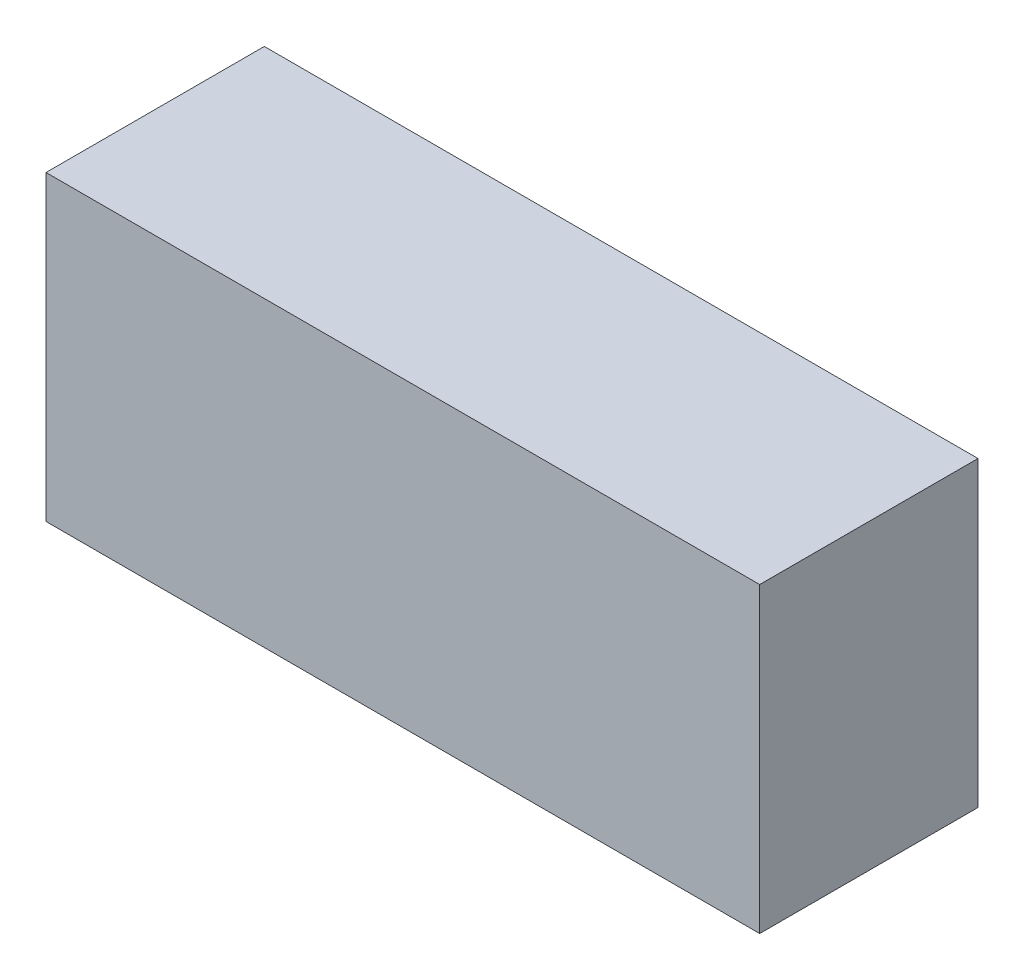
ISO-10303-21;
HEADER;
FILE_DESCRIPTION(('STEP AP214'),'2;1');
FILE_NAME('part.step','',(''),(''),'','','');
FILE_SCHEMA(('AUTOMOTIVE_DESIGN { 1 0 10303 214 1 1 1 1 }'));
ENDSEC;
DATA;
#1=APPLICATION_CONTEXT('core data for automotive mechanical design processes');
#2=APPLICATION_PROTOCOL_DEFINITION('international standard','automotive_design',2000,#1);
#3=PRODUCT_CONTEXT('',#1,'mechanical');
#4=PRODUCT('Part','Part','',(#3));
#5=PRODUCT_RELATED_PRODUCT_CATEGORY('part','',(#4));
#6=PRODUCT_DEFINITION_FORMATION('','',#4);
#7=PRODUCT_DEFINITION_CONTEXT('part definition',#1,'design');
#8=PRODUCT_DEFINITION('design','',#6,#7);
#9=PRODUCT_DEFINITION_SHAPE('','',#8);
#10=(LENGTH_UNIT() NAMED_UNIT(*) SI_UNIT(.MILLI.,.METRE.));
#11=(NAMED_UNIT(*) PLANE_ANGLE_UNIT() SI_UNIT($,.RADIAN.));
#12=(NAMED_UNIT(*) SI_UNIT($,.STERADIAN.) SOLID_ANGLE_UNIT());
#13=UNCERTAINTY_MEASURE_WITH_UNIT(LENGTH_MEASURE(1.E-05),#10,'distance_accuracy_value','');
#14=(GEOMETRIC_REPRESENTATION_CONTEXT(3) GLOBAL_UNCERTAINTY_ASSIGNED_CONTEXT((#13)) GLOBAL_UNIT_ASSIGNED_CONTEXT((#10,
#11,#12)) REPRESENTATION_CONTEXT('',''));
#15=CARTESIAN_POINT('',(0.,0.,0.));
#16=DIRECTION('',(0.,0.,1.));
#17=DIRECTION('',(1.,0.,0.));
#18=AXIS2_PLACEMENT_3D('',#15,#16,#17);
#19=CARTESIAN_POINT('',(-2.125,0.9,1.3));
#20=DIRECTION('',(0.,-1.,0.));
#21=DIRECTION('',(0.,0.,-1.));
#22=AXIS2_PLACEMENT_3D('',#19,#20,#21);
#23=PLANE('',#22);
#24=DIRECTION('',(-1.,0.,0.));
#25=VECTOR('',#24,1.);
#26=CARTESIAN_POINT('',(-2.125,0.9,0.));
#27=LINE('',#26,#25);
#28=CARTESIAN_POINT('',(2.125,0.9,0.));
#29=VERTEX_POINT('',#28);
#30=CARTESIAN_POINT('',(-2.125,0.9,0.));
#31=VERTEX_POINT('',#30);
#32=EDGE_CURVE('E97',#29,#31,#27,.T.);
#33=ORIENTED_EDGE('',*,*,#32,.T.);
#34=DIRECTION('',(0.,0.,-1.));
#35=VECTOR('',#34,1.);
#36=CARTESIAN_POINT('',(-2.125,0.9,1.3));
#37=LINE('',#36,#35);
#38=CARTESIAN_POINT('',(-2.125,0.9,1.3));
#39=VERTEX_POINT('',#38);
#40=EDGE_CURVE('E11',#39,#31,#37,.T.);
#41=ORIENTED_EDGE('',*,*,#40,.F.);
#42=DIRECTION('',(-1.,0.,0.));
#43=VECTOR('',#42,1.);
#44=CARTESIAN_POINT('',(-2.125,0.9,1.3));
#45=LINE('',#44,#43);
#46=CARTESIAN_POINT('',(2.125,0.9,1.3));
#47=VERTEX_POINT('',#46);
#48=EDGE_CURVE('E85',#47,#39,#45,.T.);
#49=ORIENTED_EDGE('',*,*,#48,.F.);
#50=DIRECTION('',(0.,0.,-1.));
#51=VECTOR('',#50,1.);
#52=CARTESIAN_POINT('',(2.125,0.9,1.3));
#53=LINE('',#52,#51);
#54=EDGE_CURVE('E93',#47,#29,#53,.T.);
#55=ORIENTED_EDGE('',*,*,#54,.T.);
#56=EDGE_LOOP('',(#33,#41,#49,#55));
#57=FACE_BOUND('',#56,.T.);
#58=ADVANCED_FACE('F34',(#57),#23,.F.);
#59=CARTESIAN_POINT('',(-2.125,-0.9,1.3));
#60=DIRECTION('',(1.,0.,0.));
#61=DIRECTION('',(0.,0.,-1.));
#62=AXIS2_PLACEMENT_3D('',#59,#60,#61);
#63=PLANE('',#62);
#64=DIRECTION('',(0.,-1.,0.));
#65=VECTOR('',#64,1.);
#66=CARTESIAN_POINT('',(-2.125,-0.9,0.));
#67=LINE('',#66,#65);
#68=CARTESIAN_POINT('',(-2.125,-0.9,0.));
#69=VERTEX_POINT('',#68);
#70=EDGE_CURVE('E89',#31,#69,#67,.T.);
#71=ORIENTED_EDGE('',*,*,#70,.T.);
#72=DIRECTION('',(0.,0.,-1.));
#73=VECTOR('',#72,1.);
#74=CARTESIAN_POINT('',(-2.125,-0.9,1.3));
#75=LINE('',#74,#73);
#76=CARTESIAN_POINT('',(-2.125,-0.9,1.3));
#77=VERTEX_POINT('',#76);
#78=EDGE_CURVE('E42',#77,#69,#75,.T.);
#79=ORIENTED_EDGE('',*,*,#78,.F.);
#80=DIRECTION('',(0.,-1.,0.));
#81=VECTOR('',#80,1.);
#82=CARTESIAN_POINT('',(-2.125,-0.9,1.3));
#83=LINE('',#82,#81);
#84=EDGE_CURVE('E80',#39,#77,#83,.T.);
#85=ORIENTED_EDGE('',*,*,#84,.F.);
#86=ORIENTED_EDGE('',*,*,#40,.T.);
#87=EDGE_LOOP('',(#71,#79,#85,#86));
#88=FACE_BOUND('',#87,.T.);
#89=ADVANCED_FACE('F88',(#88),#63,.F.);
#90=CARTESIAN_POINT('',(2.125,-0.9,1.3));
#91=DIRECTION('',(0.,1.,0.));
#92=DIRECTION('',(0.,0.,1.));
#93=AXIS2_PLACEMENT_3D('',#90,#91,#92);
#94=PLANE('',#93);
#95=DIRECTION('',(1.,0.,0.));
#96=VECTOR('',#95,1.);
#97=CARTESIAN_POINT('',(2.125,-0.9,0.));
#98=LINE('',#97,#96);
#99=CARTESIAN_POINT('',(2.125,-0.9,0.));
#100=VERTEX_POINT('',#99);
#101=EDGE_CURVE('E67',#69,#100,#98,.T.);
#102=ORIENTED_EDGE('',*,*,#101,.T.);
#103=DIRECTION('',(0.,0.,-1.));
#104=VECTOR('',#103,1.);
#105=CARTESIAN_POINT('',(2.125,-0.9,1.3));
#106=LINE('',#105,#104);
#107=CARTESIAN_POINT('',(2.125,-0.9,1.3));
#108=VERTEX_POINT('',#107);
#109=EDGE_CURVE('E90',#108,#100,#106,.T.);
#110=ORIENTED_EDGE('',*,*,#109,.F.);
#111=DIRECTION('',(1.,0.,0.));
#112=VECTOR('',#111,1.);
#113=CARTESIAN_POINT('',(2.125,-0.9,1.3));
#114=LINE('',#113,#112);
#115=EDGE_CURVE('E83',#77,#108,#114,.T.);
#116=ORIENTED_EDGE('',*,*,#115,.F.);
#117=ORIENTED_EDGE('',*,*,#78,.T.);
#118=EDGE_LOOP('',(#102,#110,#116,#117));
#119=FACE_BOUND('',#118,.T.);
#120=ADVANCED_FACE('F91',(#119),#94,.F.);
#121=CARTESIAN_POINT('',(2.125,0.9,1.3));
#122=DIRECTION('',(-1.,0.,0.));
#123=DIRECTION('',(0.,0.,1.));
#124=AXIS2_PLACEMENT_3D('',#121,#122,#123);
#125=PLANE('',#124);
#126=DIRECTION('',(0.,1.,0.));
#127=VECTOR('',#126,1.);
#128=CARTESIAN_POINT('',(2.125,0.9,0.));
#129=LINE('',#128,#127);
#130=EDGE_CURVE('E73',#100,#29,#129,.T.);
#131=ORIENTED_EDGE('',*,*,#130,.T.);
#132=ORIENTED_EDGE('',*,*,#54,.F.);
#133=DIRECTION('',(0.,1.,0.));
#134=VECTOR('',#133,1.);
#135=CARTESIAN_POINT('',(2.125,0.9,1.3));
#136=LINE('',#135,#134);
#137=EDGE_CURVE('E50',#108,#47,#136,.T.);
#138=ORIENTED_EDGE('',*,*,#137,.F.);
#139=ORIENTED_EDGE('',*,*,#109,.T.);
#140=EDGE_LOOP('',(#131,#132,#138,#139));
#141=FACE_BOUND('',#140,.T.);
#142=ADVANCED_FACE('F104',(#141),#125,.F.);
#143=CARTESIAN_POINT('',(0.,0.,1.3));
#144=DIRECTION('',(0.,0.,-1.));
#145=DIRECTION('',(-1.,0.,0.));
#146=AXIS2_PLACEMENT_3D('',#143,#144,#145);
#147=PLANE('',#146);
#148=ORIENTED_EDGE('',*,*,#48,.T.);
#149=ORIENTED_EDGE('',*,*,#84,.T.);
#150=ORIENTED_EDGE('',*,*,#115,.T.);
#151=ORIENTED_EDGE('',*,*,#137,.T.);
#152=EDGE_LOOP('',(#148,#149,#150,#151));
#153=FACE_BOUND('',#152,.T.);
#154=ADVANCED_FACE('F81',(#153),#147,.F.);
#155=CARTESIAN_POINT('',(0.,0.,0.));
#156=DIRECTION('',(0.,0.,-1.));
#157=DIRECTION('',(-1.,0.,0.));
#158=AXIS2_PLACEMENT_3D('',#155,#156,#157);
#159=PLANE('',#158);
#160=ORIENTED_EDGE('',*,*,#32,.F.);
#161=ORIENTED_EDGE('',*,*,#130,.F.);
#162=ORIENTED_EDGE('',*,*,#101,.F.);
#163=ORIENTED_EDGE('',*,*,#70,.F.);
#164=EDGE_LOOP('',(#160,#161,#162,#163));
#165=FACE_BOUND('',#164,.T.);
#166=ADVANCED_FACE('F107',(#165),#159,.T.);
#167=CLOSED_SHELL('',(#58,#89,#120,#142,#154,#166));
#168=MANIFOLD_SOLID_BREP('B2',#167);
#169=ADVANCED_BREP_SHAPE_REPRESENTATION('',(#18,#168),#14);
#170=SHAPE_DEFINITION_REPRESENTATION(#9,#169);
ENDSEC;
END-ISO-10303-21;
